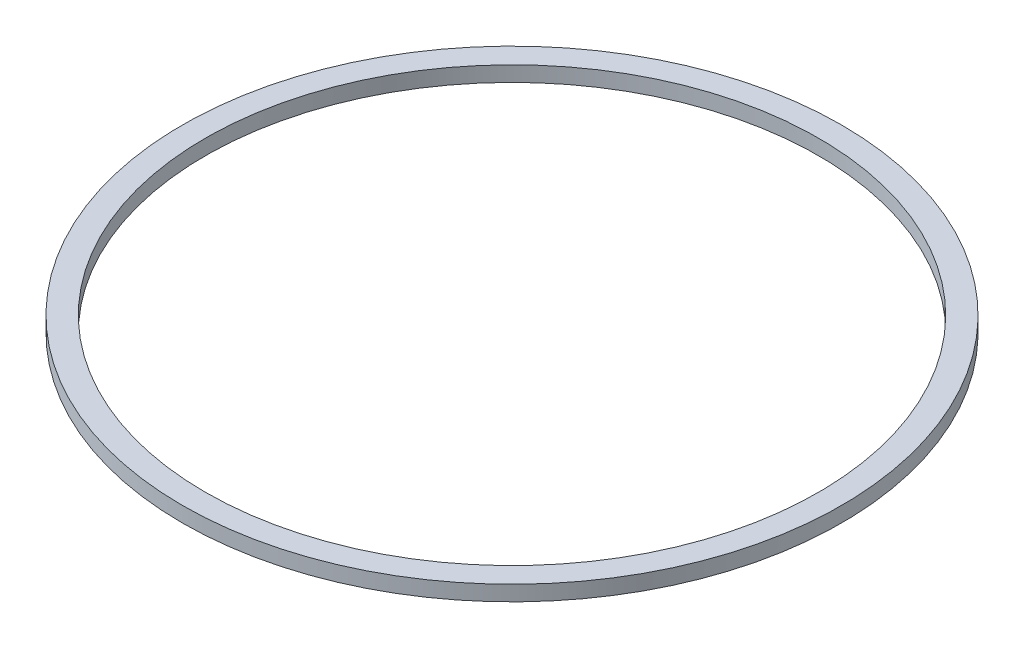
ISO-10303-21;
HEADER;
FILE_DESCRIPTION(('STEP AP214'),'2;1');
FILE_NAME('part.step','',(''),(''),'','','');
FILE_SCHEMA(('AUTOMOTIVE_DESIGN { 1 0 10303 214 1 1 1 1 }'));
ENDSEC;
DATA;
#1=APPLICATION_CONTEXT('core data for automotive mechanical design processes');
#2=APPLICATION_PROTOCOL_DEFINITION('international standard','automotive_design',2000,#1);
#3=PRODUCT_CONTEXT('',#1,'mechanical');
#4=PRODUCT('Part','Part','',(#3));
#5=PRODUCT_RELATED_PRODUCT_CATEGORY('part','',(#4));
#6=PRODUCT_DEFINITION_FORMATION('','',#4);
#7=PRODUCT_DEFINITION_CONTEXT('part definition',#1,'design');
#8=PRODUCT_DEFINITION('design','',#6,#7);
#9=PRODUCT_DEFINITION_SHAPE('','',#8);
#10=(LENGTH_UNIT() NAMED_UNIT(*) SI_UNIT(.MILLI.,.METRE.));
#11=(NAMED_UNIT(*) PLANE_ANGLE_UNIT() SI_UNIT($,.RADIAN.));
#12=(NAMED_UNIT(*) SI_UNIT($,.STERADIAN.) SOLID_ANGLE_UNIT());
#13=UNCERTAINTY_MEASURE_WITH_UNIT(LENGTH_MEASURE(1.E-05),#10,'distance_accuracy_value','');
#14=(GEOMETRIC_REPRESENTATION_CONTEXT(3) GLOBAL_UNCERTAINTY_ASSIGNED_CONTEXT((#13)) GLOBAL_UNIT_ASSIGNED_CONTEXT((#10,
#11,#12)) REPRESENTATION_CONTEXT('',''));
#15=CARTESIAN_POINT('',(0.,0.,0.));
#16=DIRECTION('',(0.,0.,1.));
#17=DIRECTION('',(1.,0.,0.));
#18=AXIS2_PLACEMENT_3D('',#15,#16,#17);
#19=CARTESIAN_POINT('',(0.,2.,0.));
#20=DIRECTION('',(0.,1.,0.));
#21=DIRECTION('',(0.,0.,1.));
#22=AXIS2_PLACEMENT_3D('',#19,#20,#21);
#23=PLANE('',#22);
#24=CARTESIAN_POINT('',(0.,2.,0.));
#25=DIRECTION('',(0.,1.,0.));
#26=DIRECTION('',(0.,0.,1.));
#27=AXIS2_PLACEMENT_3D('',#24,#25,#26);
#28=CIRCLE('',#27,43.2);
#29=CARTESIAN_POINT('',(0.,2.,43.2));
#30=VERTEX_POINT('',#29);
#31=EDGE_CURVE('E10',#30,#30,#28,.T.);
#32=ORIENTED_EDGE('',*,*,#31,.T.);
#33=EDGE_LOOP('',(#32));
#34=FACE_BOUND('',#33,.T.);
#35=CARTESIAN_POINT('',(0.,2.,0.));
#36=DIRECTION('',(0.,1.,0.));
#37=DIRECTION('',(0.,0.,1.));
#38=AXIS2_PLACEMENT_3D('',#35,#36,#37);
#39=CIRCLE('',#38,40.2);
#40=CARTESIAN_POINT('',(0.,2.,40.2));
#41=VERTEX_POINT('',#40);
#42=EDGE_CURVE('E48',#41,#41,#39,.T.);
#43=ORIENTED_EDGE('',*,*,#42,.F.);
#44=EDGE_LOOP('',(#43));
#45=FACE_BOUND('',#44,.T.);
#46=ADVANCED_FACE('F37',(#34,#45),#23,.T.);
#47=CARTESIAN_POINT('',(0.,0.,0.));
#48=DIRECTION('',(0.,1.,0.));
#49=DIRECTION('',(0.,0.,1.));
#50=AXIS2_PLACEMENT_3D('',#47,#48,#49);
#51=PLANE('',#50);
#52=CARTESIAN_POINT('',(0.,0.,0.));
#53=DIRECTION('',(0.,1.,0.));
#54=DIRECTION('',(0.,0.,1.));
#55=AXIS2_PLACEMENT_3D('',#52,#53,#54);
#56=CIRCLE('',#55,43.2);
#57=CARTESIAN_POINT('',(0.,0.,43.2));
#58=VERTEX_POINT('',#57);
#59=EDGE_CURVE('E41',#58,#58,#56,.T.);
#60=ORIENTED_EDGE('',*,*,#59,.F.);
#61=EDGE_LOOP('',(#60));
#62=FACE_BOUND('',#61,.T.);
#63=CARTESIAN_POINT('',(0.,0.,0.));
#64=DIRECTION('',(0.,1.,0.));
#65=DIRECTION('',(0.,0.,1.));
#66=AXIS2_PLACEMENT_3D('',#63,#64,#65);
#67=CIRCLE('',#66,40.2);
#68=CARTESIAN_POINT('',(0.,0.,40.2));
#69=VERTEX_POINT('',#68);
#70=EDGE_CURVE('E50',#69,#69,#67,.T.);
#71=ORIENTED_EDGE('',*,*,#70,.T.);
#72=EDGE_LOOP('',(#71));
#73=FACE_BOUND('',#72,.T.);
#74=ADVANCED_FACE('F60',(#62,#73),#51,.F.);
#75=CARTESIAN_POINT('',(0.,2.,0.));
#76=DIRECTION('',(0.,-1.,0.));
#77=DIRECTION('',(0.,0.,-1.));
#78=AXIS2_PLACEMENT_3D('',#75,#76,#77);
#79=CYLINDRICAL_SURFACE('',#78,43.2);
#80=ORIENTED_EDGE('',*,*,#31,.F.);
#81=EDGE_LOOP('',(#80));
#82=FACE_BOUND('',#81,.T.);
#83=ORIENTED_EDGE('',*,*,#59,.T.);
#84=EDGE_LOOP('',(#83));
#85=FACE_BOUND('',#84,.T.);
#86=ADVANCED_FACE('F39',(#82,#85),#79,.T.);
#87=CARTESIAN_POINT('',(0.,2.,0.));
#88=DIRECTION('',(0.,-1.,0.));
#89=DIRECTION('',(0.,0.,-1.));
#90=AXIS2_PLACEMENT_3D('',#87,#88,#89);
#91=CYLINDRICAL_SURFACE('',#90,40.2);
#92=ORIENTED_EDGE('',*,*,#42,.T.);
#93=EDGE_LOOP('',(#92));
#94=FACE_BOUND('',#93,.T.);
#95=ORIENTED_EDGE('',*,*,#70,.F.);
#96=EDGE_LOOP('',(#95));
#97=FACE_BOUND('',#96,.T.);
#98=ADVANCED_FACE('F56',(#94,#97),#91,.F.);
#99=CLOSED_SHELL('',(#46,#74,#86,#98));
#100=MANIFOLD_SOLID_BREP('B2',#99);
#101=ADVANCED_BREP_SHAPE_REPRESENTATION('',(#18,#100),#14);
#102=SHAPE_DEFINITION_REPRESENTATION(#9,#101);
ENDSEC;
END-ISO-10303-21;
